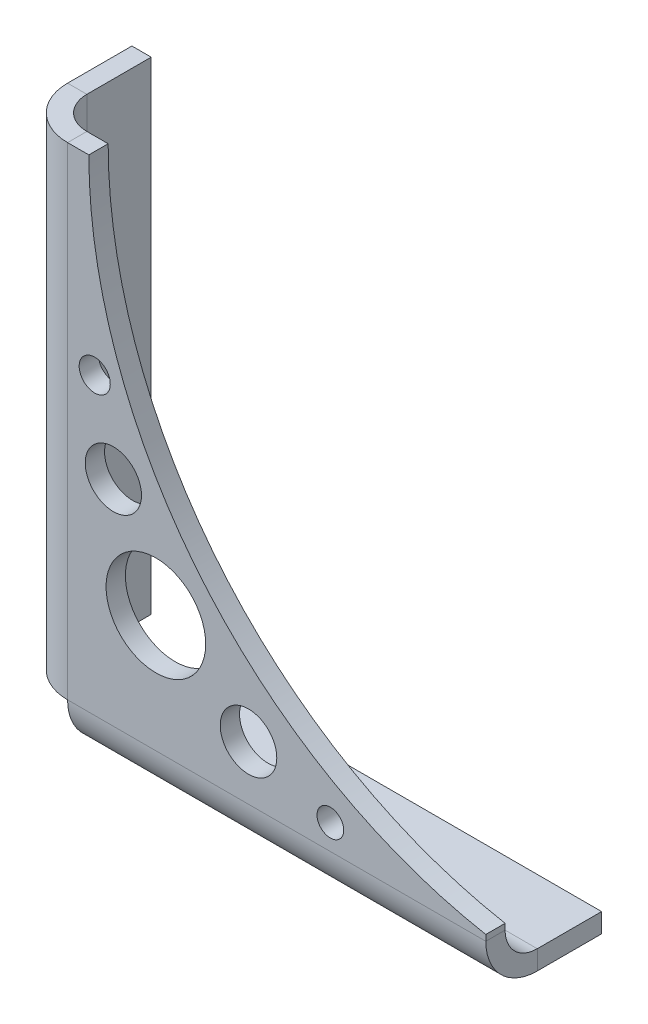
ISO-10303-21;
HEADER;
FILE_DESCRIPTION(('STEP AP214'),'2;1');
FILE_NAME('part.step','',(''),(''),'','','');
FILE_SCHEMA(('AUTOMOTIVE_DESIGN { 1 0 10303 214 1 1 1 1 }'));
ENDSEC;
DATA;
#1=APPLICATION_CONTEXT('core data for automotive mechanical design processes');
#2=APPLICATION_PROTOCOL_DEFINITION('international standard','automotive_design',2000,#1);
#3=PRODUCT_CONTEXT('',#1,'mechanical');
#4=PRODUCT('Part','Part','',(#3));
#5=PRODUCT_RELATED_PRODUCT_CATEGORY('part','',(#4));
#6=PRODUCT_DEFINITION_FORMATION('','',#4);
#7=PRODUCT_DEFINITION_CONTEXT('part definition',#1,'design');
#8=PRODUCT_DEFINITION('design','',#6,#7);
#9=PRODUCT_DEFINITION_SHAPE('','',#8);
#10=(LENGTH_UNIT() NAMED_UNIT(*) SI_UNIT(.MILLI.,.METRE.));
#11=(NAMED_UNIT(*) PLANE_ANGLE_UNIT() SI_UNIT($,.RADIAN.));
#12=(NAMED_UNIT(*) SI_UNIT($,.STERADIAN.) SOLID_ANGLE_UNIT());
#13=UNCERTAINTY_MEASURE_WITH_UNIT(LENGTH_MEASURE(1.E-05),#10,'distance_accuracy_value','');
#14=(GEOMETRIC_REPRESENTATION_CONTEXT(3) GLOBAL_UNCERTAINTY_ASSIGNED_CONTEXT((#13)) GLOBAL_UNIT_ASSIGNED_CONTEXT((#10,
#11,#12)) REPRESENTATION_CONTEXT('',''));
#15=CARTESIAN_POINT('',(0.,0.,0.));
#16=DIRECTION('',(0.,0.,1.));
#17=DIRECTION('',(1.,0.,0.));
#18=AXIS2_PLACEMENT_3D('',#15,#16,#17);
#19=CARTESIAN_POINT('',(76.5003580726784,-26.2665587423584,0.));
#20=DIRECTION('',(1.,0.,0.));
#21=DIRECTION('',(0.,1.,0.));
#22=AXIS2_PLACEMENT_3D('',#19,#20,#21);
#23=PLANE('',#22);
#24=DIRECTION('',(0.,0.,-1.));
#25=VECTOR('',#24,1.);
#26=CARTESIAN_POINT('',(76.5003580726784,-24.4289597998915,0.));
#27=LINE('',#26,#25);
#28=CARTESIAN_POINT('',(76.5003580726784,-24.4289597998914,6.));
#29=VERTEX_POINT('',#28);
#30=CARTESIAN_POINT('',(76.5003580726784,-24.4289597998915,0.));
#31=VERTEX_POINT('',#30);
#32=EDGE_CURVE('E13',#29,#31,#27,.T.);
#33=ORIENTED_EDGE('',*,*,#32,.F.);
#34=DIRECTION('',(0.,1.,0.));
#35=VECTOR('',#34,1.);
#36=CARTESIAN_POINT('',(76.5003580726784,123.733441257642,6.));
#37=LINE('',#36,#35);
#38=CARTESIAN_POINT('',(76.5003580726784,-26.2665587423584,6.));
#39=VERTEX_POINT('',#38);
#40=EDGE_CURVE('E245',#39,#29,#37,.T.);
#41=ORIENTED_EDGE('',*,*,#40,.F.);
#42=DIRECTION('',(0.,0.,-1.));
#43=VECTOR('',#42,1.);
#44=CARTESIAN_POINT('',(76.5003580726784,-26.2665587423584,0.));
#45=LINE('',#44,#43);
#46=CARTESIAN_POINT('',(76.5003580726784,-26.2665587423584,0.));
#47=VERTEX_POINT('',#46);
#48=EDGE_CURVE('E90',#39,#47,#45,.T.);
#49=ORIENTED_EDGE('',*,*,#48,.T.);
#50=DIRECTION('',(0.,1.,0.));
#51=VECTOR('',#50,1.);
#52=CARTESIAN_POINT('',(76.5003580726784,-26.2665587423584,0.));
#53=LINE('',#52,#51);
#54=EDGE_CURVE('E215',#47,#31,#53,.T.);
#55=ORIENTED_EDGE('',*,*,#54,.T.);
#56=EDGE_LOOP('',(#33,#41,#49,#55));
#57=FACE_BOUND('',#56,.T.);
#58=ADVANCED_FACE('F80',(#57),#23,.T.);
#59=CARTESIAN_POINT('',(-46.8867405616699,123.733441257642,0.));
#60=DIRECTION('',(0.,1.,0.));
#61=DIRECTION('',(-1.,0.,0.));
#62=AXIS2_PLACEMENT_3D('',#59,#60,#61);
#63=PLANE('',#62);
#64=DIRECTION('',(0.,0.,-1.));
#65=VECTOR('',#64,1.);
#66=CARTESIAN_POINT('',(-53.4996419273216,123.733441257642,0.));
#67=LINE('',#66,#65);
#68=CARTESIAN_POINT('',(-53.4996419273216,123.733441257642,5.99999999999998));
#69=VERTEX_POINT('',#68);
#70=CARTESIAN_POINT('',(-53.4996419273216,123.733441257642,0.));
#71=VERTEX_POINT('',#70);
#72=EDGE_CURVE('E248',#69,#71,#67,.T.);
#73=ORIENTED_EDGE('',*,*,#72,.F.);
#74=DIRECTION('',(1.,0.,0.));
#75=VECTOR('',#74,1.);
#76=CARTESIAN_POINT('',(103.76301783287,123.733441257642,6.));
#77=LINE('',#76,#75);
#78=CARTESIAN_POINT('',(-46.88674056167,123.733441257642,6.));
#79=VERTEX_POINT('',#78);
#80=EDGE_CURVE('E236',#79,#69,#77,.F.);
#81=ORIENTED_EDGE('',*,*,#80,.F.);
#82=DIRECTION('',(0.,0.,-1.));
#83=VECTOR('',#82,1.);
#84=CARTESIAN_POINT('',(-46.88674056167,123.733441257642,0.));
#85=LINE('',#84,#83);
#86=CARTESIAN_POINT('',(-46.88674056167,123.733441257642,0.));
#87=VERTEX_POINT('',#86);
#88=EDGE_CURVE('E84',#79,#87,#85,.T.);
#89=ORIENTED_EDGE('',*,*,#88,.T.);
#90=DIRECTION('',(-1.,0.,0.));
#91=VECTOR('',#90,1.);
#92=CARTESIAN_POINT('',(-46.8867405616699,123.733441257642,0.));
#93=LINE('',#92,#91);
#94=EDGE_CURVE('E210',#87,#71,#93,.T.);
#95=ORIENTED_EDGE('',*,*,#94,.T.);
#96=EDGE_LOOP('',(#73,#81,#89,#95));
#97=FACE_BOUND('',#96,.T.);
#98=ADVANCED_FACE('F273',(#97),#63,.T.);
#99=CARTESIAN_POINT('',(-45.0627347075425,65.3650842677678,0.));
#100=DIRECTION('',(0.,0.,1.));
#101=DIRECTION('',(1.,0.,0.));
#102=AXIS2_PLACEMENT_3D('',#99,#100,#101);
#103=CYLINDRICAL_SURFACE('',#102,4.83341279820593);
#104=CARTESIAN_POINT('',(-45.0627347075425,65.3650842677678,0.));
#105=DIRECTION('',(0.,0.,1.));
#106=DIRECTION('',(1.,0.,0.));
#107=AXIS2_PLACEMENT_3D('',#104,#105,#106);
#108=CIRCLE('',#107,4.83341279820593);
#109=CARTESIAN_POINT('',(-40.2293219093366,65.3650842677678,0.));
#110=VERTEX_POINT('',#109);
#111=EDGE_CURVE('E194',#110,#110,#108,.T.);
#112=ORIENTED_EDGE('',*,*,#111,.F.);
#113=EDGE_LOOP('',(#112));
#114=FACE_BOUND('',#113,.T.);
#115=CARTESIAN_POINT('',(-45.0627347075425,65.3650842677678,6.));
#116=DIRECTION('',(0.,0.,1.));
#117=DIRECTION('',(1.,0.,0.));
#118=AXIS2_PLACEMENT_3D('',#115,#116,#117);
#119=CIRCLE('',#118,4.83341279820593);
#120=CARTESIAN_POINT('',(-40.2293219093366,65.3650842677678,6.));
#121=VERTEX_POINT('',#120);
#122=EDGE_CURVE('E190',#121,#121,#119,.T.);
#123=ORIENTED_EDGE('',*,*,#122,.T.);
#124=EDGE_LOOP('',(#123));
#125=FACE_BOUND('',#124,.T.);
#126=ADVANCED_FACE('F277',(#114,#125),#103,.F.);
#127=CARTESIAN_POINT('',(-39.2676423416134,40.2457915790819,0.));
#128=DIRECTION('',(0.,0.,1.));
#129=DIRECTION('',(1.,0.,0.));
#130=AXIS2_PLACEMENT_3D('',#127,#128,#129);
#131=CYLINDRICAL_SURFACE('',#130,8.73823218464054);
#132=CARTESIAN_POINT('',(-39.2676423416134,40.2457915790819,0.));
#133=DIRECTION('',(0.,0.,1.));
#134=DIRECTION('',(1.,0.,0.));
#135=AXIS2_PLACEMENT_3D('',#132,#133,#134);
#136=CIRCLE('',#135,8.73823218464054);
#137=CARTESIAN_POINT('',(-30.5294101569729,40.2457915790819,0.));
#138=VERTEX_POINT('',#137);
#139=EDGE_CURVE('E197',#138,#138,#136,.T.);
#140=ORIENTED_EDGE('',*,*,#139,.F.);
#141=EDGE_LOOP('',(#140));
#142=FACE_BOUND('',#141,.T.);
#143=CARTESIAN_POINT('',(-39.2676423416134,40.2457915790819,6.));
#144=DIRECTION('',(0.,0.,1.));
#145=DIRECTION('',(1.,0.,0.));
#146=AXIS2_PLACEMENT_3D('',#143,#144,#145);
#147=CIRCLE('',#146,8.73823218464054);
#148=CARTESIAN_POINT('',(-30.5294101569729,40.2457915790819,6.));
#149=VERTEX_POINT('',#148);
#150=EDGE_CURVE('E224',#149,#149,#147,.T.);
#151=ORIENTED_EDGE('',*,*,#150,.T.);
#152=EDGE_LOOP('',(#151));
#153=FACE_BOUND('',#152,.T.);
#154=ADVANCED_FACE('F287',(#142,#153),#131,.F.);
#155=CARTESIAN_POINT('',(-26.0490765508905,10.1852938512934,0.));
#156=DIRECTION('',(0.,0.,1.));
#157=DIRECTION('',(1.,0.,0.));
#158=AXIS2_PLACEMENT_3D('',#155,#156,#157);
#159=CYLINDRICAL_SURFACE('',#158,15.4819761986573);
#160=CARTESIAN_POINT('',(-26.0490765508905,10.1852938512934,0.));
#161=DIRECTION('',(0.,0.,1.));
#162=DIRECTION('',(1.,0.,0.));
#163=AXIS2_PLACEMENT_3D('',#160,#161,#162);
#164=CIRCLE('',#163,15.4819761986573);
#165=CARTESIAN_POINT('',(-10.5671003522332,10.1852938512934,0.));
#166=VERTEX_POINT('',#165);
#167=EDGE_CURVE('E201',#166,#166,#164,.T.);
#168=ORIENTED_EDGE('',*,*,#167,.F.);
#169=EDGE_LOOP('',(#168));
#170=FACE_BOUND('',#169,.T.);
#171=CARTESIAN_POINT('',(-26.0490765508905,10.1852938512934,6.));
#172=DIRECTION('',(0.,0.,1.));
#173=DIRECTION('',(1.,0.,0.));
#174=AXIS2_PLACEMENT_3D('',#171,#172,#173);
#175=CIRCLE('',#174,15.4819761986573);
#176=CARTESIAN_POINT('',(-10.5671003522332,10.1852938512934,6.));
#177=VERTEX_POINT('',#176);
#178=EDGE_CURVE('E227',#177,#177,#175,.T.);
#179=ORIENTED_EDGE('',*,*,#178,.T.);
#180=EDGE_LOOP('',(#179));
#181=FACE_BOUND('',#180,.T.);
#182=ADVANCED_FACE('F283',(#170,#181),#159,.F.);
#183=CARTESIAN_POINT('',(2.73739447848698,-9.38908056539844,0.));
#184=DIRECTION('',(0.,0.,1.));
#185=DIRECTION('',(1.,0.,0.));
#186=AXIS2_PLACEMENT_3D('',#183,#184,#185);
#187=CYLINDRICAL_SURFACE('',#186,8.7913765769656);
#188=CARTESIAN_POINT('',(2.73739447848698,-9.38908056539844,0.));
#189=DIRECTION('',(0.,0.,1.));
#190=DIRECTION('',(1.,0.,0.));
#191=AXIS2_PLACEMENT_3D('',#188,#189,#190);
#192=CIRCLE('',#191,8.7913765769656);
#193=CARTESIAN_POINT('',(11.5287710554526,-9.38908056539844,0.));
#194=VERTEX_POINT('',#193);
#195=EDGE_CURVE('E204',#194,#194,#192,.T.);
#196=ORIENTED_EDGE('',*,*,#195,.F.);
#197=EDGE_LOOP('',(#196));
#198=FACE_BOUND('',#197,.T.);
#199=CARTESIAN_POINT('',(2.73739447848698,-9.38908056539844,6.));
#200=DIRECTION('',(0.,0.,1.));
#201=DIRECTION('',(1.,0.,0.));
#202=AXIS2_PLACEMENT_3D('',#199,#200,#201);
#203=CIRCLE('',#202,8.7913765769656);
#204=CARTESIAN_POINT('',(11.5287710554526,-9.38908056539844,6.));
#205=VERTEX_POINT('',#204);
#206=EDGE_CURVE('E230',#205,#205,#203,.T.);
#207=ORIENTED_EDGE('',*,*,#206,.T.);
#208=EDGE_LOOP('',(#207));
#209=FACE_BOUND('',#208,.T.);
#210=ADVANCED_FACE('F269',(#198,#209),#187,.F.);
#211=CARTESIAN_POINT('',(28.1890713362145,-18.4817020351602,0.));
#212=DIRECTION('',(0.,0.,1.));
#213=DIRECTION('',(1.,0.,0.));
#214=AXIS2_PLACEMENT_3D('',#211,#212,#213);
#215=CYLINDRICAL_SURFACE('',#214,4.14840951836482);
#216=CARTESIAN_POINT('',(28.1890713362145,-18.4817020351602,0.));
#217=DIRECTION('',(0.,0.,1.));
#218=DIRECTION('',(1.,0.,0.));
#219=AXIS2_PLACEMENT_3D('',#216,#217,#218);
#220=CIRCLE('',#219,4.14840951836482);
#221=CARTESIAN_POINT('',(32.3374808545793,-18.4817020351602,0.));
#222=VERTEX_POINT('',#221);
#223=EDGE_CURVE('E207',#222,#222,#220,.T.);
#224=ORIENTED_EDGE('',*,*,#223,.F.);
#225=EDGE_LOOP('',(#224));
#226=FACE_BOUND('',#225,.T.);
#227=CARTESIAN_POINT('',(28.1890713362145,-18.4817020351602,6.));
#228=DIRECTION('',(0.,0.,1.));
#229=DIRECTION('',(1.,0.,0.));
#230=AXIS2_PLACEMENT_3D('',#227,#228,#229);
#231=CIRCLE('',#230,4.14840951836482);
#232=CARTESIAN_POINT('',(32.3374808545793,-18.4817020351602,6.));
#233=VERTEX_POINT('',#232);
#234=EDGE_CURVE('E233',#233,#233,#231,.T.);
#235=ORIENTED_EDGE('',*,*,#234,.T.);
#236=EDGE_LOOP('',(#235));
#237=FACE_BOUND('',#236,.T.);
#238=ADVANCED_FACE('F261',(#226,#237),#215,.F.);
#239=CARTESIAN_POINT('',(103.76301783287,123.733441257642,0.));
#240=DIRECTION('',(0.,0.,-1.));
#241=DIRECTION('',(-1.,0.,0.));
#242=AXIS2_PLACEMENT_3D('',#239,#240,#241);
#243=CYLINDRICAL_SURFACE('',#242,150.64975839454);
#244=CARTESIAN_POINT('',(103.76301783287,123.733441257642,6.));
#245=DIRECTION('',(0.,0.,-1.));
#246=DIRECTION('',(-1.,0.,0.));
#247=AXIS2_PLACEMENT_3D('',#244,#245,#246);
#248=CIRCLE('',#247,150.64975839454);
#249=EDGE_CURVE('E239',#29,#79,#248,.T.);
#250=ORIENTED_EDGE('',*,*,#249,.F.);
#251=ORIENTED_EDGE('',*,*,#32,.T.);
#252=CARTESIAN_POINT('',(103.76301783287,123.733441257642,0.));
#253=DIRECTION('',(0.,0.,-1.));
#254=DIRECTION('',(1.,0.,0.));
#255=AXIS2_PLACEMENT_3D('',#252,#253,#254);
#256=CIRCLE('',#255,150.64975839454);
#257=EDGE_CURVE('E213',#31,#87,#256,.T.);
#258=ORIENTED_EDGE('',*,*,#257,.T.);
#259=ORIENTED_EDGE('',*,*,#88,.F.);
#260=EDGE_LOOP('',(#250,#251,#258,#259));
#261=FACE_BOUND('',#260,.T.);
#262=ADVANCED_FACE('F82',(#261),#243,.F.);
#263=CARTESIAN_POINT('',(103.76301783287,123.733441257642,0.));
#264=DIRECTION('',(0.,0.,1.));
#265=DIRECTION('',(1.,0.,0.));
#266=AXIS2_PLACEMENT_3D('',#263,#264,#265);
#267=PLANE('',#266);
#268=ORIENTED_EDGE('',*,*,#111,.T.);
#269=EDGE_LOOP('',(#268));
#270=FACE_BOUND('',#269,.T.);
#271=ORIENTED_EDGE('',*,*,#139,.T.);
#272=EDGE_LOOP('',(#271));
#273=FACE_BOUND('',#272,.T.);
#274=ORIENTED_EDGE('',*,*,#167,.T.);
#275=EDGE_LOOP('',(#274));
#276=FACE_BOUND('',#275,.T.);
#277=ORIENTED_EDGE('',*,*,#195,.T.);
#278=EDGE_LOOP('',(#277));
#279=FACE_BOUND('',#278,.T.);
#280=ORIENTED_EDGE('',*,*,#223,.T.);
#281=EDGE_LOOP('',(#280));
#282=FACE_BOUND('',#281,.T.);
#283=ORIENTED_EDGE('',*,*,#94,.F.);
#284=ORIENTED_EDGE('',*,*,#257,.F.);
#285=ORIENTED_EDGE('',*,*,#54,.F.);
#286=DIRECTION('',(1.,0.,0.));
#287=VECTOR('',#286,1.);
#288=CARTESIAN_POINT('',(-53.4996419273216,-26.2665587423584,0.));
#289=LINE('',#288,#287);
#290=CARTESIAN_POINT('',(-53.4996419273216,-26.2665587423584,0.));
#291=VERTEX_POINT('',#290);
#292=EDGE_CURVE('E217',#291,#47,#289,.T.);
#293=ORIENTED_EDGE('',*,*,#292,.F.);
#294=DIRECTION('',(0.,-1.,0.));
#295=VECTOR('',#294,1.);
#296=CARTESIAN_POINT('',(-53.4996419273216,123.733441257642,0.));
#297=LINE('',#296,#295);
#298=EDGE_CURVE('E219',#71,#291,#297,.T.);
#299=ORIENTED_EDGE('',*,*,#298,.F.);
#300=EDGE_LOOP('',(#283,#284,#285,#293,#299));
#301=FACE_BOUND('',#300,.T.);
#302=ADVANCED_FACE('F258',(#270,#273,#276,#279,#282,#301),#267,.F.);
#303=CARTESIAN_POINT('',(103.76301783287,123.733441257642,6.));
#304=DIRECTION('',(0.,0.,1.));
#305=DIRECTION('',(1.,0.,0.));
#306=AXIS2_PLACEMENT_3D('',#303,#304,#305);
#307=PLANE('',#306);
#308=ORIENTED_EDGE('',*,*,#122,.F.);
#309=EDGE_LOOP('',(#308));
#310=FACE_BOUND('',#309,.T.);
#311=ORIENTED_EDGE('',*,*,#150,.F.);
#312=EDGE_LOOP('',(#311));
#313=FACE_BOUND('',#312,.T.);
#314=ORIENTED_EDGE('',*,*,#178,.F.);
#315=EDGE_LOOP('',(#314));
#316=FACE_BOUND('',#315,.T.);
#317=ORIENTED_EDGE('',*,*,#206,.F.);
#318=EDGE_LOOP('',(#317));
#319=FACE_BOUND('',#318,.T.);
#320=ORIENTED_EDGE('',*,*,#234,.F.);
#321=EDGE_LOOP('',(#320));
#322=FACE_BOUND('',#321,.T.);
#323=ORIENTED_EDGE('',*,*,#80,.T.);
#324=DIRECTION('',(0.,1.,0.));
#325=VECTOR('',#324,1.);
#326=CARTESIAN_POINT('',(-53.4996419273216,123.733441257642,6.));
#327=LINE('',#326,#325);
#328=CARTESIAN_POINT('',(-53.4996419273216,-26.2665587423584,6.));
#329=VERTEX_POINT('',#328);
#330=EDGE_CURVE('E198',#69,#329,#327,.F.);
#331=ORIENTED_EDGE('',*,*,#330,.T.);
#332=DIRECTION('',(1.,0.,0.));
#333=VECTOR('',#332,1.);
#334=CARTESIAN_POINT('',(103.76301783287,-26.2665587423584,6.));
#335=LINE('',#334,#333);
#336=EDGE_CURVE('E242',#329,#39,#335,.T.);
#337=ORIENTED_EDGE('',*,*,#336,.T.);
#338=ORIENTED_EDGE('',*,*,#40,.T.);
#339=ORIENTED_EDGE('',*,*,#249,.T.);
#340=EDGE_LOOP('',(#323,#331,#337,#338,#339));
#341=FACE_BOUND('',#340,.T.);
#342=ADVANCED_FACE('F266',(#310,#313,#316,#319,#322,#341),#307,.T.);
#343=CARTESIAN_POINT('',(76.5003580726784,-26.2665587423584,-10.));
#344=DIRECTION('',(1.,0.,0.));
#345=DIRECTION('',(0.,0.,-1.));
#346=AXIS2_PLACEMENT_3D('',#343,#344,#345);
#347=PLANE('',#346);
#348=DIRECTION('',(0.,1.,0.));
#349=VECTOR('',#348,1.);
#350=CARTESIAN_POINT('',(76.5003580726784,-42.2665587423584,-9.99999999999995));
#351=LINE('',#350,#349);
#352=CARTESIAN_POINT('',(76.5003580726784,-36.2665587423584,-9.99999999999997));
#353=VERTEX_POINT('',#352);
#354=CARTESIAN_POINT('',(76.5003580726784,-42.2665587423584,-9.99999999999995));
#355=VERTEX_POINT('',#354);
#356=EDGE_CURVE('E150',#353,#355,#351,.F.);
#357=ORIENTED_EDGE('',*,*,#356,.F.);
#358=CARTESIAN_POINT('',(76.5003580726784,-26.2665587423584,-10.));
#359=DIRECTION('',(-1.,0.,0.));
#360=DIRECTION('',(0.,0.,1.));
#361=AXIS2_PLACEMENT_3D('',#358,#359,#360);
#362=CIRCLE('',#361,10.);
#363=EDGE_CURVE('E144',#47,#353,#362,.F.);
#364=ORIENTED_EDGE('',*,*,#363,.F.);
#365=ORIENTED_EDGE('',*,*,#48,.F.);
#366=CARTESIAN_POINT('',(76.5003580726784,-26.2665587423584,-10.));
#367=DIRECTION('',(-1.,0.,0.));
#368=DIRECTION('',(0.,0.,1.));
#369=AXIS2_PLACEMENT_3D('',#366,#367,#368);
#370=CIRCLE('',#369,16.);
#371=EDGE_CURVE('E187',#39,#355,#370,.F.);
#372=ORIENTED_EDGE('',*,*,#371,.T.);
#373=EDGE_LOOP('',(#357,#364,#365,#372));
#374=FACE_BOUND('',#373,.T.);
#375=ADVANCED_FACE('F296',(#374),#347,.T.);
#376=CARTESIAN_POINT('',(-53.4996419273216,-26.2665587423584,-10.));
#377=DIRECTION('',(1.,0.,0.));
#378=DIRECTION('',(0.,0.,-1.));
#379=AXIS2_PLACEMENT_3D('',#376,#377,#378);
#380=PLANE('',#379);
#381=CARTESIAN_POINT('',(-53.4996419273216,-26.2665587423584,-10.));
#382=DIRECTION('',(-1.,0.,0.));
#383=DIRECTION('',(0.,0.,1.));
#384=AXIS2_PLACEMENT_3D('',#381,#382,#383);
#385=CIRCLE('',#384,10.);
#386=CARTESIAN_POINT('',(-53.4996419273216,-36.2665587423584,-9.99999999999997));
#387=VERTEX_POINT('',#386);
#388=EDGE_CURVE('E141',#387,#291,#385,.T.);
#389=ORIENTED_EDGE('',*,*,#388,.F.);
#390=DIRECTION('',(0.,1.,0.));
#391=VECTOR('',#390,1.);
#392=CARTESIAN_POINT('',(-53.4996419273216,-36.2665587423584,-9.99999999999997));
#393=LINE('',#392,#391);
#394=CARTESIAN_POINT('',(-53.4996419273216,-42.2665587423584,-9.99999999999995));
#395=VERTEX_POINT('',#394);
#396=EDGE_CURVE('E149',#387,#395,#393,.F.);
#397=ORIENTED_EDGE('',*,*,#396,.T.);
#398=CARTESIAN_POINT('',(-53.4996419273216,-26.2665587423584,-10.));
#399=DIRECTION('',(-1.,0.,0.));
#400=DIRECTION('',(0.,0.,1.));
#401=AXIS2_PLACEMENT_3D('',#398,#399,#400);
#402=CIRCLE('',#401,16.);
#403=EDGE_CURVE('E191',#395,#329,#402,.T.);
#404=ORIENTED_EDGE('',*,*,#403,.T.);
#405=DIRECTION('',(0.,0.,-1.));
#406=VECTOR('',#405,1.);
#407=CARTESIAN_POINT('',(-53.4996419273216,-26.2665587423584,0.));
#408=LINE('',#407,#406);
#409=EDGE_CURVE('E160',#329,#291,#408,.T.);
#410=ORIENTED_EDGE('',*,*,#409,.T.);
#411=EDGE_LOOP('',(#389,#397,#404,#410));
#412=FACE_BOUND('',#411,.T.);
#413=ADVANCED_FACE('F156',(#412),#380,.F.);
#414=CARTESIAN_POINT('',(-53.4996419273216,-26.2665587423584,-10.));
#415=DIRECTION('',(-1.,0.,0.));
#416=DIRECTION('',(0.,-1.,0.));
#417=AXIS2_PLACEMENT_3D('',#414,#415,#416);
#418=CYLINDRICAL_SURFACE('',#417,16.);
#419=ORIENTED_EDGE('',*,*,#336,.F.);
#420=ORIENTED_EDGE('',*,*,#403,.F.);
#421=DIRECTION('',(-1.,0.,0.));
#422=VECTOR('',#421,1.);
#423=CARTESIAN_POINT('',(76.5003580726784,-42.2665587423584,-9.99999999999995));
#424=LINE('',#423,#422);
#425=EDGE_CURVE('E173',#395,#355,#424,.F.);
#426=ORIENTED_EDGE('',*,*,#425,.T.);
#427=ORIENTED_EDGE('',*,*,#371,.F.);
#428=EDGE_LOOP('',(#419,#420,#426,#427));
#429=FACE_BOUND('',#428,.T.);
#430=ADVANCED_FACE('F301',(#429),#418,.T.);
#431=CARTESIAN_POINT('',(-53.4996419273216,-26.2665587423584,-10.));
#432=DIRECTION('',(-1.,0.,0.));
#433=DIRECTION('',(0.,-1.,0.));
#434=AXIS2_PLACEMENT_3D('',#431,#432,#433);
#435=CYLINDRICAL_SURFACE('',#434,10.);
#436=ORIENTED_EDGE('',*,*,#292,.T.);
#437=ORIENTED_EDGE('',*,*,#363,.T.);
#438=DIRECTION('',(-1.,0.,0.));
#439=VECTOR('',#438,1.);
#440=CARTESIAN_POINT('',(76.5003580726784,-36.2665587423584,-9.99999999999997));
#441=LINE('',#440,#439);
#442=EDGE_CURVE('E137',#353,#387,#441,.T.);
#443=ORIENTED_EDGE('',*,*,#442,.T.);
#444=ORIENTED_EDGE('',*,*,#388,.T.);
#445=EDGE_LOOP('',(#436,#437,#443,#444));
#446=FACE_BOUND('',#445,.T.);
#447=ADVANCED_FACE('F139',(#446),#435,.F.);
#448=CARTESIAN_POINT('',(-53.4996419273216,-42.2665587423584,-30.));
#449=DIRECTION('',(1.,0.,0.));
#450=DIRECTION('',(0.,0.,-1.));
#451=AXIS2_PLACEMENT_3D('',#448,#449,#450);
#452=PLANE('',#451);
#453=ORIENTED_EDGE('',*,*,#396,.F.);
#454=DIRECTION('',(0.,0.,1.));
#455=VECTOR('',#454,1.);
#456=CARTESIAN_POINT('',(-53.4996419273216,-36.2665587423584,-30.));
#457=LINE('',#456,#455);
#458=CARTESIAN_POINT('',(-53.4996419273216,-36.2665587423584,-30.));
#459=VERTEX_POINT('',#458);
#460=EDGE_CURVE('E169',#387,#459,#457,.F.);
#461=ORIENTED_EDGE('',*,*,#460,.T.);
#462=DIRECTION('',(0.,1.,0.));
#463=VECTOR('',#462,1.);
#464=CARTESIAN_POINT('',(-53.4996419273216,-42.2665587423584,-30.));
#465=LINE('',#464,#463);
#466=CARTESIAN_POINT('',(-53.4996419273216,-42.2665587423584,-30.));
#467=VERTEX_POINT('',#466);
#468=EDGE_CURVE('E161',#467,#459,#465,.T.);
#469=ORIENTED_EDGE('',*,*,#468,.F.);
#470=DIRECTION('',(0.,0.,-1.));
#471=VECTOR('',#470,1.);
#472=CARTESIAN_POINT('',(-53.4996419273216,-42.2665587423583,0.));
#473=LINE('',#472,#471);
#474=EDGE_CURVE('E172',#395,#467,#473,.T.);
#475=ORIENTED_EDGE('',*,*,#474,.F.);
#476=EDGE_LOOP('',(#453,#461,#469,#475));
#477=FACE_BOUND('',#476,.T.);
#478=ADVANCED_FACE('F166',(#477),#452,.F.);
#479=CARTESIAN_POINT('',(76.5003580726784,-42.2665587423583,0.));
#480=DIRECTION('',(-1.,0.,0.));
#481=DIRECTION('',(0.,0.,1.));
#482=AXIS2_PLACEMENT_3D('',#479,#480,#481);
#483=PLANE('',#482);
#484=ORIENTED_EDGE('',*,*,#356,.T.);
#485=DIRECTION('',(0.,0.,1.));
#486=VECTOR('',#485,1.);
#487=CARTESIAN_POINT('',(76.5003580726784,-42.2665587423583,1.12079320200045E-13));
#488=LINE('',#487,#486);
#489=CARTESIAN_POINT('',(76.5003580726784,-42.2665587423584,-30.));
#490=VERTEX_POINT('',#489);
#491=EDGE_CURVE('E421',#490,#355,#488,.T.);
#492=ORIENTED_EDGE('',*,*,#491,.F.);
#493=DIRECTION('',(0.,1.,0.));
#494=VECTOR('',#493,1.);
#495=CARTESIAN_POINT('',(76.5003580726784,-42.2665587423584,-30.));
#496=LINE('',#495,#494);
#497=CARTESIAN_POINT('',(76.5003580726784,-36.2665587423584,-30.));
#498=VERTEX_POINT('',#497);
#499=EDGE_CURVE('E418',#490,#498,#496,.T.);
#500=ORIENTED_EDGE('',*,*,#499,.T.);
#501=DIRECTION('',(0.,0.,-1.));
#502=VECTOR('',#501,1.);
#503=CARTESIAN_POINT('',(76.5003580726784,-36.2665587423583,0.));
#504=LINE('',#503,#502);
#505=EDGE_CURVE('E180',#498,#353,#504,.F.);
#506=ORIENTED_EDGE('',*,*,#505,.T.);
#507=EDGE_LOOP('',(#484,#492,#500,#506));
#508=FACE_BOUND('',#507,.T.);
#509=ADVANCED_FACE('F311',(#508),#483,.F.);
#510=CARTESIAN_POINT('',(0.,-42.2665587423583,1.12079320200045E-13));
#511=DIRECTION('',(0.,1.,0.));
#512=DIRECTION('',(0.,0.,1.));
#513=AXIS2_PLACEMENT_3D('',#510,#511,#512);
#514=PLANE('',#513);
#515=ORIENTED_EDGE('',*,*,#425,.F.);
#516=ORIENTED_EDGE('',*,*,#474,.T.);
#517=DIRECTION('',(1.,0.,0.));
#518=VECTOR('',#517,1.);
#519=CARTESIAN_POINT('',(0.,-42.2665587423584,-30.));
#520=LINE('',#519,#518);
#521=EDGE_CURVE('E424',#467,#490,#520,.T.);
#522=ORIENTED_EDGE('',*,*,#521,.T.);
#523=ORIENTED_EDGE('',*,*,#491,.T.);
#524=EDGE_LOOP('',(#515,#516,#522,#523));
#525=FACE_BOUND('',#524,.T.);
#526=ADVANCED_FACE('F319',(#525),#514,.F.);
#527=CARTESIAN_POINT('',(0.,-36.2665587423583,0.));
#528=DIRECTION('',(0.,1.,0.));
#529=DIRECTION('',(0.,0.,1.));
#530=AXIS2_PLACEMENT_3D('',#527,#528,#529);
#531=PLANE('',#530);
#532=ORIENTED_EDGE('',*,*,#460,.F.);
#533=ORIENTED_EDGE('',*,*,#442,.F.);
#534=ORIENTED_EDGE('',*,*,#505,.F.);
#535=DIRECTION('',(-1.,0.,0.));
#536=VECTOR('',#535,1.);
#537=CARTESIAN_POINT('',(76.5003580726784,-36.2665587423584,-30.));
#538=LINE('',#537,#536);
#539=EDGE_CURVE('E178',#459,#498,#538,.F.);
#540=ORIENTED_EDGE('',*,*,#539,.F.);
#541=EDGE_LOOP('',(#532,#533,#534,#540));
#542=FACE_BOUND('',#541,.T.);
#543=ADVANCED_FACE('F176',(#542),#531,.T.);
#544=CARTESIAN_POINT('',(76.5003580726784,-42.2665587423584,-30.));
#545=DIRECTION('',(0.,0.,1.));
#546=DIRECTION('',(0.,-1.,0.));
#547=AXIS2_PLACEMENT_3D('',#544,#545,#546);
#548=PLANE('',#547);
#549=ORIENTED_EDGE('',*,*,#539,.T.);
#550=ORIENTED_EDGE('',*,*,#499,.F.);
#551=ORIENTED_EDGE('',*,*,#521,.F.);
#552=ORIENTED_EDGE('',*,*,#468,.T.);
#553=EDGE_LOOP('',(#549,#550,#551,#552));
#554=FACE_BOUND('',#553,.T.);
#555=ADVANCED_FACE('F312',(#554),#548,.F.);
#556=CARTESIAN_POINT('',(-53.4996419273216,-26.2665587423584,-10.));
#557=DIRECTION('',(0.,-1.,0.));
#558=DIRECTION('',(0.,0.,-1.));
#559=AXIS2_PLACEMENT_3D('',#556,#557,#558);
#560=PLANE('',#559);
#561=DIRECTION('',(1.,0.,0.));
#562=VECTOR('',#561,1.);
#563=CARTESIAN_POINT('',(-69.4996419273216,-26.2665587423584,-9.99999999999995));
#564=LINE('',#563,#562);
#565=CARTESIAN_POINT('',(-63.4996419273216,-26.2665587423584,-9.99999999999996));
#566=VERTEX_POINT('',#565);
#567=CARTESIAN_POINT('',(-69.4996419273216,-26.2665587423584,-9.99999999999994));
#568=VERTEX_POINT('',#567);
#569=EDGE_CURVE('E404',#566,#568,#564,.F.);
#570=ORIENTED_EDGE('',*,*,#569,.F.);
#571=CARTESIAN_POINT('',(-53.4996419273216,-26.2665587423584,-10.));
#572=DIRECTION('',(0.,1.,0.));
#573=DIRECTION('',(0.,0.,1.));
#574=AXIS2_PLACEMENT_3D('',#571,#572,#573);
#575=CIRCLE('',#574,9.99999999999999);
#576=EDGE_CURVE('E411',#291,#566,#575,.F.);
#577=ORIENTED_EDGE('',*,*,#576,.F.);
#578=ORIENTED_EDGE('',*,*,#409,.F.);
#579=CARTESIAN_POINT('',(-53.4996419273216,-26.2665587423584,-10.));
#580=DIRECTION('',(0.,1.,0.));
#581=DIRECTION('',(0.,0.,1.));
#582=AXIS2_PLACEMENT_3D('',#579,#580,#581);
#583=CIRCLE('',#582,16.);
#584=EDGE_CURVE('E119',#329,#568,#583,.F.);
#585=ORIENTED_EDGE('',*,*,#584,.T.);
#586=EDGE_LOOP('',(#570,#577,#578,#585));
#587=FACE_BOUND('',#586,.T.);
#588=ADVANCED_FACE('F315',(#587),#560,.T.);
#589=CARTESIAN_POINT('',(-53.4996419273216,123.733441257642,-10.));
#590=DIRECTION('',(0.,-1.,0.));
#591=DIRECTION('',(0.,0.,-1.));
#592=AXIS2_PLACEMENT_3D('',#589,#590,#591);
#593=PLANE('',#592);
#594=CARTESIAN_POINT('',(-53.4996419273216,123.733441257642,-10.));
#595=DIRECTION('',(0.,1.,0.));
#596=DIRECTION('',(0.,0.,1.));
#597=AXIS2_PLACEMENT_3D('',#594,#595,#596);
#598=CIRCLE('',#597,9.99999999999999);
#599=CARTESIAN_POINT('',(-63.4996419273216,123.733441257642,-9.99999999999998));
#600=VERTEX_POINT('',#599);
#601=EDGE_CURVE('E414',#600,#71,#598,.T.);
#602=ORIENTED_EDGE('',*,*,#601,.F.);
#603=DIRECTION('',(1.,0.,0.));
#604=VECTOR('',#603,1.);
#605=CARTESIAN_POINT('',(-63.4996419273216,123.733441257642,-9.99999999999997));
#606=LINE('',#605,#604);
#607=CARTESIAN_POINT('',(-69.4996419273216,123.733441257642,-9.99999999999995));
#608=VERTEX_POINT('',#607);
#609=EDGE_CURVE('E378',#600,#608,#606,.F.);
#610=ORIENTED_EDGE('',*,*,#609,.T.);
#611=CARTESIAN_POINT('',(-53.4996419273216,123.733441257642,-10.));
#612=DIRECTION('',(0.,1.,0.));
#613=DIRECTION('',(0.,0.,1.));
#614=AXIS2_PLACEMENT_3D('',#611,#612,#613);
#615=CIRCLE('',#614,16.);
#616=EDGE_CURVE('E408',#608,#69,#615,.T.);
#617=ORIENTED_EDGE('',*,*,#616,.T.);
#618=ORIENTED_EDGE('',*,*,#72,.T.);
#619=EDGE_LOOP('',(#602,#610,#617,#618));
#620=FACE_BOUND('',#619,.T.);
#621=ADVANCED_FACE('F326',(#620),#593,.F.);
#622=CARTESIAN_POINT('',(-53.4996419273216,123.733441257642,-10.));
#623=DIRECTION('',(0.,1.,0.));
#624=DIRECTION('',(-1.,0.,0.));
#625=AXIS2_PLACEMENT_3D('',#622,#623,#624);
#626=CYLINDRICAL_SURFACE('',#625,16.);
#627=ORIENTED_EDGE('',*,*,#330,.F.);
#628=ORIENTED_EDGE('',*,*,#616,.F.);
#629=DIRECTION('',(0.,1.,0.));
#630=VECTOR('',#629,1.);
#631=CARTESIAN_POINT('',(-69.4996419273216,-26.2665587423584,-9.99999999999995));
#632=LINE('',#631,#630);
#633=EDGE_CURVE('E365',#608,#568,#632,.F.);
#634=ORIENTED_EDGE('',*,*,#633,.T.);
#635=ORIENTED_EDGE('',*,*,#584,.F.);
#636=EDGE_LOOP('',(#627,#628,#634,#635));
#637=FACE_BOUND('',#636,.T.);
#638=ADVANCED_FACE('F329',(#637),#626,.T.);
#639=CARTESIAN_POINT('',(-53.4996419273216,123.733441257642,-10.));
#640=DIRECTION('',(0.,1.,0.));
#641=DIRECTION('',(-1.,0.,0.));
#642=AXIS2_PLACEMENT_3D('',#639,#640,#641);
#643=CYLINDRICAL_SURFACE('',#642,9.99999999999999);
#644=ORIENTED_EDGE('',*,*,#298,.T.);
#645=ORIENTED_EDGE('',*,*,#576,.T.);
#646=DIRECTION('',(0.,1.,0.));
#647=VECTOR('',#646,1.);
#648=CARTESIAN_POINT('',(-63.4996419273216,-26.2665587423584,-9.99999999999997));
#649=LINE('',#648,#647);
#650=EDGE_CURVE('E401',#566,#600,#649,.T.);
#651=ORIENTED_EDGE('',*,*,#650,.T.);
#652=ORIENTED_EDGE('',*,*,#601,.T.);
#653=EDGE_LOOP('',(#644,#645,#651,#652));
#654=FACE_BOUND('',#653,.T.);
#655=ADVANCED_FACE('F334',(#654),#643,.F.);
#656=CARTESIAN_POINT('',(-69.4996419273217,123.733441257642,-30.));
#657=DIRECTION('',(0.,-1.,0.));
#658=DIRECTION('',(0.,0.,-1.));
#659=AXIS2_PLACEMENT_3D('',#656,#657,#658);
#660=PLANE('',#659);
#661=ORIENTED_EDGE('',*,*,#609,.F.);
#662=DIRECTION('',(0.,0.,1.));
#663=VECTOR('',#662,1.);
#664=CARTESIAN_POINT('',(-63.4996419273217,123.733441257642,-30.));
#665=LINE('',#664,#663);
#666=CARTESIAN_POINT('',(-63.4996419273217,123.733441257642,-30.));
#667=VERTEX_POINT('',#666);
#668=EDGE_CURVE('E377',#600,#667,#665,.F.);
#669=ORIENTED_EDGE('',*,*,#668,.T.);
#670=DIRECTION('',(1.,0.,0.));
#671=VECTOR('',#670,1.);
#672=CARTESIAN_POINT('',(-69.4996419273217,123.733441257642,-30.));
#673=LINE('',#672,#671);
#674=CARTESIAN_POINT('',(-69.4996419273217,123.733441257642,-30.));
#675=VERTEX_POINT('',#674);
#676=EDGE_CURVE('E387',#675,#667,#673,.T.);
#677=ORIENTED_EDGE('',*,*,#676,.F.);
#678=DIRECTION('',(0.,0.,-1.));
#679=VECTOR('',#678,1.);
#680=CARTESIAN_POINT('',(-69.4996419273216,123.733441257642,2.63801272398555E-13));
#681=LINE('',#680,#679);
#682=EDGE_CURVE('E369',#608,#675,#681,.T.);
#683=ORIENTED_EDGE('',*,*,#682,.F.);
#684=EDGE_LOOP('',(#661,#669,#677,#683));
#685=FACE_BOUND('',#684,.T.);
#686=ADVANCED_FACE('F337',(#685),#660,.F.);
#687=CARTESIAN_POINT('',(-69.4996419273216,-26.2665587423584,0.));
#688=DIRECTION('',(0.,1.,0.));
#689=DIRECTION('',(-1.,0.,0.));
#690=AXIS2_PLACEMENT_3D('',#687,#688,#689);
#691=PLANE('',#690);
#692=ORIENTED_EDGE('',*,*,#569,.T.);
#693=DIRECTION('',(0.,0.,1.));
#694=VECTOR('',#693,1.);
#695=CARTESIAN_POINT('',(-69.4996419273216,-26.2665587423584,2.06563057648414E-13));
#696=LINE('',#695,#694);
#697=CARTESIAN_POINT('',(-69.4996419273217,-26.2665587423584,-30.));
#698=VERTEX_POINT('',#697);
#699=EDGE_CURVE('E373',#698,#568,#696,.T.);
#700=ORIENTED_EDGE('',*,*,#699,.F.);
#701=DIRECTION('',(1.,0.,0.));
#702=VECTOR('',#701,1.);
#703=CARTESIAN_POINT('',(-69.4996419273217,-26.2665587423584,-30.));
#704=LINE('',#703,#702);
#705=CARTESIAN_POINT('',(-63.4996419273217,-26.2665587423584,-30.));
#706=VERTEX_POINT('',#705);
#707=EDGE_CURVE('E460',#698,#706,#704,.T.);
#708=ORIENTED_EDGE('',*,*,#707,.T.);
#709=DIRECTION('',(0.,0.,-1.));
#710=VECTOR('',#709,1.);
#711=CARTESIAN_POINT('',(-63.4996419273216,-26.2665587423584,0.));
#712=LINE('',#711,#710);
#713=EDGE_CURVE('E389',#706,#566,#712,.F.);
#714=ORIENTED_EDGE('',*,*,#713,.T.);
#715=EDGE_LOOP('',(#692,#700,#708,#714));
#716=FACE_BOUND('',#715,.T.);
#717=ADVANCED_FACE('F343',(#716),#691,.F.);
#718=CARTESIAN_POINT('',(-69.4996419273216,0.,2.06563057648414E-13));
#719=DIRECTION('',(1.,0.,0.));
#720=DIRECTION('',(0.,0.,-1.));
#721=AXIS2_PLACEMENT_3D('',#718,#719,#720);
#722=PLANE('',#721);
#723=ORIENTED_EDGE('',*,*,#633,.F.);
#724=ORIENTED_EDGE('',*,*,#682,.T.);
#725=DIRECTION('',(0.,-1.,0.));
#726=VECTOR('',#725,1.);
#727=CARTESIAN_POINT('',(-69.4996419273217,0.,-30.));
#728=LINE('',#727,#726);
#729=EDGE_CURVE('E388',#675,#698,#728,.T.);
#730=ORIENTED_EDGE('',*,*,#729,.T.);
#731=ORIENTED_EDGE('',*,*,#699,.T.);
#732=EDGE_LOOP('',(#723,#724,#730,#731));
#733=FACE_BOUND('',#732,.T.);
#734=ADVANCED_FACE('F352',(#733),#722,.F.);
#735=CARTESIAN_POINT('',(-63.4996419273216,0.,1.85614169615356E-13));
#736=DIRECTION('',(1.,0.,0.));
#737=DIRECTION('',(0.,0.,-1.));
#738=AXIS2_PLACEMENT_3D('',#735,#736,#737);
#739=PLANE('',#738);
#740=ORIENTED_EDGE('',*,*,#668,.F.);
#741=ORIENTED_EDGE('',*,*,#650,.F.);
#742=ORIENTED_EDGE('',*,*,#713,.F.);
#743=DIRECTION('',(0.,1.,0.));
#744=VECTOR('',#743,1.);
#745=CARTESIAN_POINT('',(-63.4996419273217,-26.2665587423584,-30.));
#746=LINE('',#745,#744);
#747=EDGE_CURVE('E393',#667,#706,#746,.F.);
#748=ORIENTED_EDGE('',*,*,#747,.F.);
#749=EDGE_LOOP('',(#740,#741,#742,#748));
#750=FACE_BOUND('',#749,.T.);
#751=ADVANCED_FACE('F348',(#750),#739,.T.);
#752=CARTESIAN_POINT('',(-69.4996419273217,-26.2665587423584,-30.));
#753=DIRECTION('',(0.,0.,1.));
#754=DIRECTION('',(1.,0.,0.));
#755=AXIS2_PLACEMENT_3D('',#752,#753,#754);
#756=PLANE('',#755);
#757=ORIENTED_EDGE('',*,*,#747,.T.);
#758=ORIENTED_EDGE('',*,*,#707,.F.);
#759=ORIENTED_EDGE('',*,*,#729,.F.);
#760=ORIENTED_EDGE('',*,*,#676,.T.);
#761=EDGE_LOOP('',(#757,#758,#759,#760));
#762=FACE_BOUND('',#761,.T.);
#763=ADVANCED_FACE('F345',(#762),#756,.F.);
#764=CLOSED_SHELL('',(#58,#98,#126,#154,#182,#210,#238,#262,#302,#342,#375,#413,#430,#447,#478,
#509,#526,#543,#555,#588,#621,#638,#655,#686,#717,#734,#751,#763));
#765=MANIFOLD_SOLID_BREP('B2',#764);
#766=ADVANCED_BREP_SHAPE_REPRESENTATION('',(#18,#765),#14);
#767=SHAPE_DEFINITION_REPRESENTATION(#9,#766);
ENDSEC;
END-ISO-10303-21;
